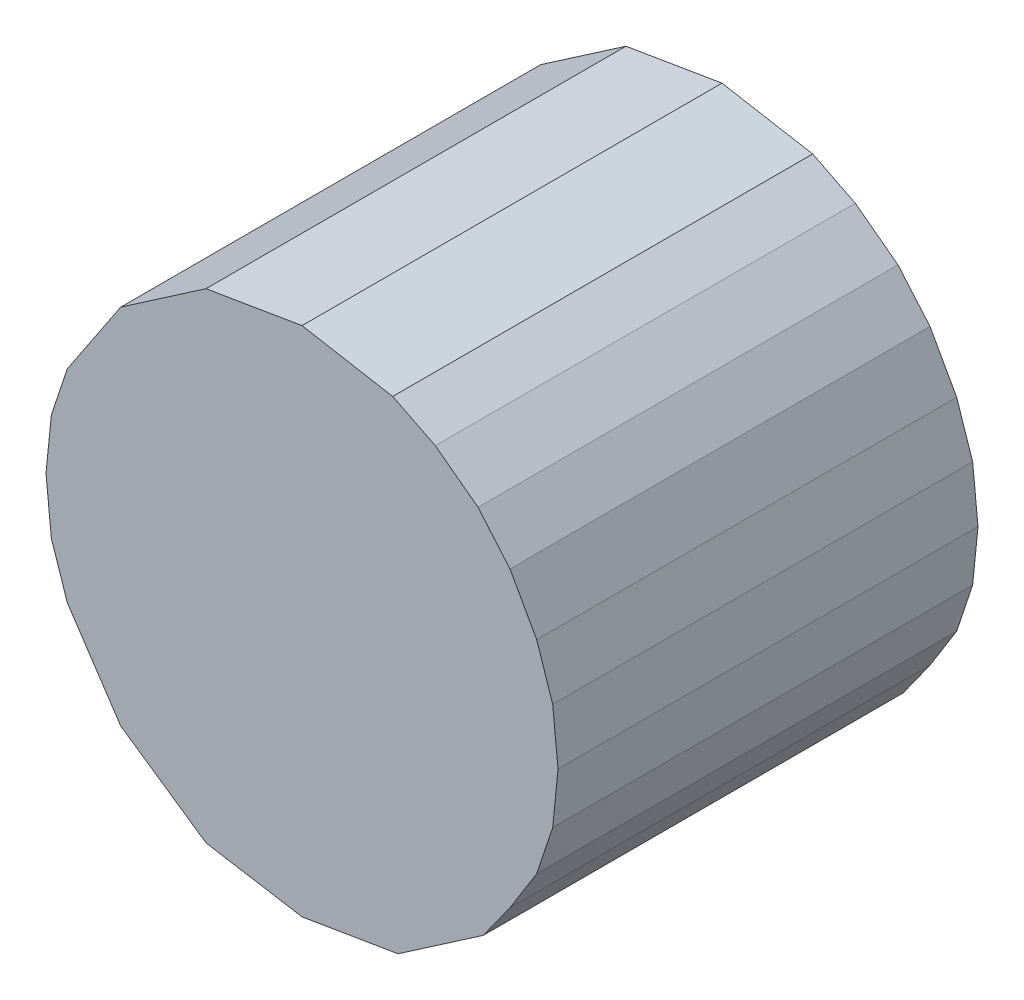
ISO-10303-21;
HEADER;
FILE_DESCRIPTION(('STEP AP214'),'2;1');
FILE_NAME('part.step','',(''),(''),'','','');
FILE_SCHEMA(('AUTOMOTIVE_DESIGN { 1 0 10303 214 1 1 1 1 }'));
ENDSEC;
DATA;
#1=APPLICATION_CONTEXT('core data for automotive mechanical design processes');
#2=APPLICATION_PROTOCOL_DEFINITION('international standard','automotive_design',2000,#1);
#3=PRODUCT_CONTEXT('',#1,'mechanical');
#4=PRODUCT('Part','Part','',(#3));
#5=PRODUCT_RELATED_PRODUCT_CATEGORY('part','',(#4));
#6=PRODUCT_DEFINITION_FORMATION('','',#4);
#7=PRODUCT_DEFINITION_CONTEXT('part definition',#1,'design');
#8=PRODUCT_DEFINITION('design','',#6,#7);
#9=PRODUCT_DEFINITION_SHAPE('','',#8);
#10=(LENGTH_UNIT() NAMED_UNIT(*) SI_UNIT(.MILLI.,.METRE.));
#11=(NAMED_UNIT(*) PLANE_ANGLE_UNIT() SI_UNIT($,.RADIAN.));
#12=(NAMED_UNIT(*) SI_UNIT($,.STERADIAN.) SOLID_ANGLE_UNIT());
#13=UNCERTAINTY_MEASURE_WITH_UNIT(LENGTH_MEASURE(1.E-05),#10,'distance_accuracy_value','');
#14=(GEOMETRIC_REPRESENTATION_CONTEXT(3) GLOBAL_UNCERTAINTY_ASSIGNED_CONTEXT((#13)) GLOBAL_UNIT_ASSIGNED_CONTEXT((#10,
#11,#12)) REPRESENTATION_CONTEXT('',''));
#15=CARTESIAN_POINT('',(0.,0.,0.));
#16=DIRECTION('',(0.,0.,1.));
#17=DIRECTION('',(1.,0.,0.));
#18=AXIS2_PLACEMENT_3D('',#15,#16,#17);
#19=CARTESIAN_POINT('',(5.969,1.27,0.));
#20=DIRECTION('',(-0.948683298050514,-0.316227766016838,0.));
#21=DIRECTION('',(0.316227766016838,-0.948683298050514,0.));
#22=AXIS2_PLACEMENT_3D('',#19,#20,#21);
#23=PLANE('',#22);
#24=DIRECTION('',(0.,0.,1.));
#25=VECTOR('',#24,1.);
#26=CARTESIAN_POINT('',(5.588,2.413,0.));
#27=LINE('',#26,#25);
#28=CARTESIAN_POINT('',(5.588,2.413,0.));
#29=VERTEX_POINT('',#28);
#30=CARTESIAN_POINT('',(5.588,2.413,10.));
#31=VERTEX_POINT('',#30);
#32=EDGE_CURVE('E189',#29,#31,#27,.T.);
#33=ORIENTED_EDGE('',*,*,#32,.T.);
#34=DIRECTION('',(0.316227766016838,-0.948683298050514,0.));
#35=VECTOR('',#34,1.);
#36=CARTESIAN_POINT('',(5.969,1.27,10.));
#37=LINE('',#36,#35);
#38=CARTESIAN_POINT('',(5.969,1.27,10.));
#39=VERTEX_POINT('',#38);
#40=EDGE_CURVE('E20',#39,#31,#37,.F.);
#41=ORIENTED_EDGE('',*,*,#40,.F.);
#42=DIRECTION('',(0.,0.,1.));
#43=VECTOR('',#42,1.);
#44=CARTESIAN_POINT('',(5.969,1.27,0.));
#45=LINE('',#44,#43);
#46=CARTESIAN_POINT('',(5.969,1.27,0.));
#47=VERTEX_POINT('',#46);
#48=EDGE_CURVE('E184',#39,#47,#45,.F.);
#49=ORIENTED_EDGE('',*,*,#48,.T.);
#50=DIRECTION('',(0.316227766016838,-0.948683298050514,0.));
#51=VECTOR('',#50,1.);
#52=CARTESIAN_POINT('',(5.969,1.27,0.));
#53=LINE('',#52,#51);
#54=EDGE_CURVE('E168',#29,#47,#53,.T.);
#55=ORIENTED_EDGE('',*,*,#54,.F.);
#56=EDGE_LOOP('',(#33,#41,#49,#55));
#57=FACE_BOUND('',#56,.T.);
#58=ADVANCED_FACE('F17',(#57),#23,.F.);
#59=CARTESIAN_POINT('',(6.096,0.,0.));
#60=DIRECTION('',(-0.995037190209989,-0.0995037190209989,0.));
#61=DIRECTION('',(0.0995037190209989,-0.995037190209989,0.));
#62=AXIS2_PLACEMENT_3D('',#59,#60,#61);
#63=PLANE('',#62);
#64=ORIENTED_EDGE('',*,*,#48,.F.);
#65=DIRECTION('',(0.0995037190209989,-0.995037190209989,0.));
#66=VECTOR('',#65,1.);
#67=CARTESIAN_POINT('',(6.096,0.,10.));
#68=LINE('',#67,#66);
#69=CARTESIAN_POINT('',(6.096,0.,10.));
#70=VERTEX_POINT('',#69);
#71=EDGE_CURVE('E173',#70,#39,#68,.F.);
#72=ORIENTED_EDGE('',*,*,#71,.F.);
#73=DIRECTION('',(0.,0.,1.));
#74=VECTOR('',#73,1.);
#75=CARTESIAN_POINT('',(6.096,0.,0.));
#76=LINE('',#75,#74);
#77=CARTESIAN_POINT('',(6.096,0.,0.));
#78=VERTEX_POINT('',#77);
#79=EDGE_CURVE('E202',#70,#78,#76,.F.);
#80=ORIENTED_EDGE('',*,*,#79,.T.);
#81=DIRECTION('',(0.0995037190209989,-0.995037190209989,0.));
#82=VECTOR('',#81,1.);
#83=CARTESIAN_POINT('',(6.096,0.,0.));
#84=LINE('',#83,#82);
#85=EDGE_CURVE('E192',#47,#78,#84,.T.);
#86=ORIENTED_EDGE('',*,*,#85,.F.);
#87=EDGE_LOOP('',(#64,#72,#80,#86));
#88=FACE_BOUND('',#87,.T.);
#89=ADVANCED_FACE('F191',(#88),#63,.F.);
#90=CARTESIAN_POINT('',(5.588,2.413,0.));
#91=DIRECTION('',(-0.874157276121255,-0.485642931179142,0.));
#92=DIRECTION('',(0.485642931179142,-0.874157276121255,0.));
#93=AXIS2_PLACEMENT_3D('',#90,#91,#92);
#94=PLANE('',#93);
#95=DIRECTION('',(0.,0.,1.));
#96=VECTOR('',#95,1.);
#97=CARTESIAN_POINT('',(4.953,3.556,0.));
#98=LINE('',#97,#96);
#99=CARTESIAN_POINT('',(4.95299999999967,3.55599999999982,0.));
#100=VERTEX_POINT('',#99);
#101=CARTESIAN_POINT('',(4.95299999999967,3.55599999999982,10.));
#102=VERTEX_POINT('',#101);
#103=EDGE_CURVE('E206',#100,#102,#98,.T.);
#104=ORIENTED_EDGE('',*,*,#103,.T.);
#105=DIRECTION('',(0.485642931179142,-0.874157276121255,0.));
#106=VECTOR('',#105,1.);
#107=CARTESIAN_POINT('',(5.588,2.413,10.));
#108=LINE('',#107,#106);
#109=EDGE_CURVE('E197',#31,#102,#108,.F.);
#110=ORIENTED_EDGE('',*,*,#109,.F.);
#111=ORIENTED_EDGE('',*,*,#32,.F.);
#112=DIRECTION('',(0.485642931179142,-0.874157276121255,0.));
#113=VECTOR('',#112,1.);
#114=CARTESIAN_POINT('',(5.588,2.413,0.));
#115=LINE('',#114,#113);
#116=EDGE_CURVE('E199',#100,#29,#115,.T.);
#117=ORIENTED_EDGE('',*,*,#116,.F.);
#118=EDGE_LOOP('',(#104,#110,#111,#117));
#119=FACE_BOUND('',#118,.T.);
#120=ADVANCED_FACE('F402',(#119),#94,.F.);
#121=CARTESIAN_POINT('',(5.969,-1.27,0.));
#122=DIRECTION('',(-0.995037190209989,0.0995037190209989,0.));
#123=DIRECTION('',(-0.0995037190209989,-0.995037190209989,0.));
#124=AXIS2_PLACEMENT_3D('',#121,#122,#123);
#125=PLANE('',#124);
#126=ORIENTED_EDGE('',*,*,#79,.F.);
#127=DIRECTION('',(-0.0995037190209989,-0.995037190209989,0.));
#128=VECTOR('',#127,1.);
#129=CARTESIAN_POINT('',(5.969,-1.27,10.));
#130=LINE('',#129,#128);
#131=CARTESIAN_POINT('',(5.969,-1.27,10.));
#132=VERTEX_POINT('',#131);
#133=EDGE_CURVE('E179',#132,#70,#130,.F.);
#134=ORIENTED_EDGE('',*,*,#133,.F.);
#135=DIRECTION('',(0.,0.,1.));
#136=VECTOR('',#135,1.);
#137=CARTESIAN_POINT('',(5.969,-1.27,0.));
#138=LINE('',#137,#136);
#139=CARTESIAN_POINT('',(5.969,-1.27,0.));
#140=VERTEX_POINT('',#139);
#141=EDGE_CURVE('E216',#132,#140,#138,.F.);
#142=ORIENTED_EDGE('',*,*,#141,.T.);
#143=DIRECTION('',(-0.0995037190209989,-0.995037190209989,0.));
#144=VECTOR('',#143,1.);
#145=CARTESIAN_POINT('',(5.969,-1.27,0.));
#146=LINE('',#145,#144);
#147=EDGE_CURVE('E204',#78,#140,#146,.T.);
#148=ORIENTED_EDGE('',*,*,#147,.F.);
#149=EDGE_LOOP('',(#126,#134,#142,#148));
#150=FACE_BOUND('',#149,.T.);
#151=ADVANCED_FACE('F404',(#150),#125,.F.);
#152=CARTESIAN_POINT('',(4.953,3.556,0.));
#153=DIRECTION('',(-0.759256602365155,-0.650791373456133,0.));
#154=DIRECTION('',(0.650791373456133,-0.759256602365155,0.));
#155=AXIS2_PLACEMENT_3D('',#152,#153,#154);
#156=PLANE('',#155);
#157=DIRECTION('',(0.,0.,1.));
#158=VECTOR('',#157,1.);
#159=CARTESIAN_POINT('',(4.191,4.445,0.));
#160=LINE('',#159,#158);
#161=CARTESIAN_POINT('',(4.1909999999999,4.44499999999992,0.));
#162=VERTEX_POINT('',#161);
#163=CARTESIAN_POINT('',(4.1909999999999,4.44499999999992,10.));
#164=VERTEX_POINT('',#163);
#165=EDGE_CURVE('E225',#162,#164,#160,.T.);
#166=ORIENTED_EDGE('',*,*,#165,.T.);
#167=DIRECTION('',(0.650791373456133,-0.759256602365155,0.));
#168=VECTOR('',#167,1.);
#169=CARTESIAN_POINT('',(4.953,3.556,10.));
#170=LINE('',#169,#168);
#171=EDGE_CURVE('E209',#102,#164,#170,.F.);
#172=ORIENTED_EDGE('',*,*,#171,.F.);
#173=ORIENTED_EDGE('',*,*,#103,.F.);
#174=DIRECTION('',(0.650791373456133,-0.759256602365155,0.));
#175=VECTOR('',#174,1.);
#176=CARTESIAN_POINT('',(4.953,3.556,0.));
#177=LINE('',#176,#175);
#178=EDGE_CURVE('E211',#162,#100,#177,.T.);
#179=ORIENTED_EDGE('',*,*,#178,.F.);
#180=EDGE_LOOP('',(#166,#172,#173,#179));
#181=FACE_BOUND('',#180,.T.);
#182=ADVANCED_FACE('F399',(#181),#156,.F.);
#183=CARTESIAN_POINT('',(5.588,-2.413,0.));
#184=DIRECTION('',(-0.948683298050514,0.316227766016838,0.));
#185=DIRECTION('',(-0.316227766016838,-0.948683298050514,0.));
#186=AXIS2_PLACEMENT_3D('',#183,#184,#185);
#187=PLANE('',#186);
#188=ORIENTED_EDGE('',*,*,#141,.F.);
#189=DIRECTION('',(-0.316227766016838,-0.948683298050514,0.));
#190=VECTOR('',#189,1.);
#191=CARTESIAN_POINT('',(5.588,-2.413,10.));
#192=LINE('',#191,#190);
#193=CARTESIAN_POINT('',(5.58799999999997,-2.41299999999998,10.));
#194=VERTEX_POINT('',#193);
#195=EDGE_CURVE('E214',#194,#132,#192,.F.);
#196=ORIENTED_EDGE('',*,*,#195,.F.);
#197=DIRECTION('',(0.,0.,1.));
#198=VECTOR('',#197,1.);
#199=CARTESIAN_POINT('',(5.58799999999989,-2.41299999999993,0.));
#200=LINE('',#199,#198);
#201=CARTESIAN_POINT('',(5.58799999999997,-2.41299999999998,0.));
#202=VERTEX_POINT('',#201);
#203=EDGE_CURVE('E235',#194,#202,#200,.F.);
#204=ORIENTED_EDGE('',*,*,#203,.T.);
#205=DIRECTION('',(-0.316227766016838,-0.948683298050514,0.));
#206=VECTOR('',#205,1.);
#207=CARTESIAN_POINT('',(5.588,-2.413,0.));
#208=LINE('',#207,#206);
#209=EDGE_CURVE('E219',#140,#202,#208,.T.);
#210=ORIENTED_EDGE('',*,*,#209,.F.);
#211=EDGE_LOOP('',(#188,#196,#204,#210));
#212=FACE_BOUND('',#211,.T.);
#213=ADVANCED_FACE('F464',(#212),#187,.F.);
#214=CARTESIAN_POINT('',(-5.969,1.27,0.));
#215=DIRECTION('',(0.995037190209989,-0.0995037190209989,0.));
#216=DIRECTION('',(0.0995037190209989,0.995037190209989,0.));
#217=AXIS2_PLACEMENT_3D('',#214,#215,#216);
#218=PLANE('',#217);
#219=DIRECTION('',(0.,0.,1.));
#220=VECTOR('',#219,1.);
#221=CARTESIAN_POINT('',(-6.096,0.,0.));
#222=LINE('',#221,#220);
#223=CARTESIAN_POINT('',(-6.096,0.,0.));
#224=VERTEX_POINT('',#223);
#225=CARTESIAN_POINT('',(-6.096,0.,10.));
#226=VERTEX_POINT('',#225);
#227=EDGE_CURVE('E240',#224,#226,#222,.T.);
#228=ORIENTED_EDGE('',*,*,#227,.T.);
#229=DIRECTION('',(0.0995037190209989,0.995037190209989,0.));
#230=VECTOR('',#229,1.);
#231=CARTESIAN_POINT('',(-5.969,1.27,10.));
#232=LINE('',#231,#230);
#233=CARTESIAN_POINT('',(-5.969,1.27,10.));
#234=VERTEX_POINT('',#233);
#235=EDGE_CURVE('E221',#234,#226,#232,.F.);
#236=ORIENTED_EDGE('',*,*,#235,.F.);
#237=DIRECTION('',(0.,0.,1.));
#238=VECTOR('',#237,1.);
#239=CARTESIAN_POINT('',(-5.969,1.27,0.));
#240=LINE('',#239,#238);
#241=CARTESIAN_POINT('',(-5.969,1.27,0.));
#242=VERTEX_POINT('',#241);
#243=EDGE_CURVE('E248',#234,#242,#240,.F.);
#244=ORIENTED_EDGE('',*,*,#243,.T.);
#245=DIRECTION('',(0.0995037190209989,0.995037190209989,0.));
#246=VECTOR('',#245,1.);
#247=CARTESIAN_POINT('',(-5.969,1.27,0.));
#248=LINE('',#247,#246);
#249=EDGE_CURVE('E223',#224,#242,#248,.T.);
#250=ORIENTED_EDGE('',*,*,#249,.F.);
#251=EDGE_LOOP('',(#228,#236,#244,#250));
#252=FACE_BOUND('',#251,.T.);
#253=ADVANCED_FACE('F365',(#252),#218,.F.);
#254=CARTESIAN_POINT('',(4.191,4.445,0.));
#255=DIRECTION('',(-0.6,-0.8,0.));
#256=DIRECTION('',(0.8,-0.6,0.));
#257=AXIS2_PLACEMENT_3D('',#254,#255,#256);
#258=PLANE('',#257);
#259=DIRECTION('',(0.,0.,1.));
#260=VECTOR('',#259,1.);
#261=CARTESIAN_POINT('',(3.175,5.207,0.));
#262=LINE('',#261,#260);
#263=CARTESIAN_POINT('',(3.175,5.207,0.));
#264=VERTEX_POINT('',#263);
#265=CARTESIAN_POINT('',(3.175,5.207,10.));
#266=VERTEX_POINT('',#265);
#267=EDGE_CURVE('E253',#264,#266,#262,.T.);
#268=ORIENTED_EDGE('',*,*,#267,.T.);
#269=DIRECTION('',(0.8,-0.6,0.));
#270=VECTOR('',#269,1.);
#271=CARTESIAN_POINT('',(4.191,4.445,10.));
#272=LINE('',#271,#270);
#273=EDGE_CURVE('E228',#164,#266,#272,.F.);
#274=ORIENTED_EDGE('',*,*,#273,.F.);
#275=ORIENTED_EDGE('',*,*,#165,.F.);
#276=DIRECTION('',(0.8,-0.6,0.));
#277=VECTOR('',#276,1.);
#278=CARTESIAN_POINT('',(4.191,4.445,0.));
#279=LINE('',#278,#277);
#280=EDGE_CURVE('E230',#264,#162,#279,.T.);
#281=ORIENTED_EDGE('',*,*,#280,.F.);
#282=EDGE_LOOP('',(#268,#274,#275,#281));
#283=FACE_BOUND('',#282,.T.);
#284=ADVANCED_FACE('F396',(#283),#258,.F.);
#285=CARTESIAN_POINT('',(4.953,-3.429,0.));
#286=DIRECTION('',(-0.847998304005144,0.52999894000309,0.));
#287=DIRECTION('',(-0.52999894000309,-0.847998304005144,0.));
#288=AXIS2_PLACEMENT_3D('',#285,#286,#287);
#289=PLANE('',#288);
#290=ORIENTED_EDGE('',*,*,#203,.F.);
#291=DIRECTION('',(-0.52999894000309,-0.847998304005144,0.));
#292=VECTOR('',#291,1.);
#293=CARTESIAN_POINT('',(4.953,-3.429,10.));
#294=LINE('',#293,#292);
#295=CARTESIAN_POINT('',(4.95299999999997,-3.42899999999994,10.));
#296=VERTEX_POINT('',#295);
#297=EDGE_CURVE('E233',#296,#194,#294,.F.);
#298=ORIENTED_EDGE('',*,*,#297,.F.);
#299=DIRECTION('',(0.,0.,1.));
#300=VECTOR('',#299,1.);
#301=CARTESIAN_POINT('',(4.95299999999979,-3.42899999999985,0.));
#302=LINE('',#301,#300);
#303=CARTESIAN_POINT('',(4.95299999999997,-3.42899999999994,0.));
#304=VERTEX_POINT('',#303);
#305=EDGE_CURVE('E259',#296,#304,#302,.F.);
#306=ORIENTED_EDGE('',*,*,#305,.T.);
#307=DIRECTION('',(-0.52999894000309,-0.847998304005144,0.));
#308=VECTOR('',#307,1.);
#309=CARTESIAN_POINT('',(4.953,-3.429,0.));
#310=LINE('',#309,#308);
#311=EDGE_CURVE('E238',#202,#304,#310,.T.);
#312=ORIENTED_EDGE('',*,*,#311,.F.);
#313=EDGE_LOOP('',(#290,#298,#306,#312));
#314=FACE_BOUND('',#313,.T.);
#315=ADVANCED_FACE('F456',(#314),#289,.F.);
#316=CARTESIAN_POINT('',(-6.096,0.,0.));
#317=DIRECTION('',(0.995037190209989,0.0995037190209989,0.));
#318=DIRECTION('',(-0.0995037190209989,0.995037190209989,0.));
#319=AXIS2_PLACEMENT_3D('',#316,#317,#318);
#320=PLANE('',#319);
#321=DIRECTION('',(0.,0.,1.));
#322=VECTOR('',#321,1.);
#323=CARTESIAN_POINT('',(-5.969,-1.27,0.));
#324=LINE('',#323,#322);
#325=CARTESIAN_POINT('',(-5.969,-1.27,0.));
#326=VERTEX_POINT('',#325);
#327=CARTESIAN_POINT('',(-5.969,-1.27,10.));
#328=VERTEX_POINT('',#327);
#329=EDGE_CURVE('E264',#326,#328,#324,.T.);
#330=ORIENTED_EDGE('',*,*,#329,.T.);
#331=DIRECTION('',(-0.0995037190209989,0.995037190209989,0.));
#332=VECTOR('',#331,1.);
#333=CARTESIAN_POINT('',(-6.096,0.,10.));
#334=LINE('',#333,#332);
#335=EDGE_CURVE('E243',#226,#328,#334,.F.);
#336=ORIENTED_EDGE('',*,*,#335,.F.);
#337=ORIENTED_EDGE('',*,*,#227,.F.);
#338=DIRECTION('',(-0.0995037190209989,0.995037190209989,0.));
#339=VECTOR('',#338,1.);
#340=CARTESIAN_POINT('',(-6.096,0.,0.));
#341=LINE('',#340,#339);
#342=EDGE_CURVE('E245',#326,#224,#341,.T.);
#343=ORIENTED_EDGE('',*,*,#342,.F.);
#344=EDGE_LOOP('',(#330,#336,#337,#343));
#345=FACE_BOUND('',#344,.T.);
#346=ADVANCED_FACE('F361',(#345),#320,.F.);
#347=CARTESIAN_POINT('',(-5.588,2.413,0.));
#348=DIRECTION('',(0.948683298050514,-0.316227766016838,0.));
#349=DIRECTION('',(0.316227766016838,0.948683298050514,0.));
#350=AXIS2_PLACEMENT_3D('',#347,#348,#349);
#351=PLANE('',#350);
#352=ORIENTED_EDGE('',*,*,#243,.F.);
#353=DIRECTION('',(0.316227766016838,0.948683298050514,0.));
#354=VECTOR('',#353,1.);
#355=CARTESIAN_POINT('',(-5.969,1.27,10.));
#356=LINE('',#355,#354);
#357=CARTESIAN_POINT('',(-5.58799999999987,2.41299999999991,10.));
#358=VERTEX_POINT('',#357);
#359=EDGE_CURVE('E268',#234,#358,#356,.T.);
#360=ORIENTED_EDGE('',*,*,#359,.T.);
#361=DIRECTION('',(0.,0.,1.));
#362=VECTOR('',#361,1.);
#363=CARTESIAN_POINT('',(-5.58799999999947,2.41299999999965,0.));
#364=LINE('',#363,#362);
#365=CARTESIAN_POINT('',(-5.58799999999987,2.41299999999991,0.));
#366=VERTEX_POINT('',#365);
#367=EDGE_CURVE('E281',#358,#366,#364,.F.);
#368=ORIENTED_EDGE('',*,*,#367,.T.);
#369=DIRECTION('',(0.316227766016838,0.948683298050514,0.));
#370=VECTOR('',#369,1.);
#371=CARTESIAN_POINT('',(-5.588,2.413,0.));
#372=LINE('',#371,#370);
#373=EDGE_CURVE('E251',#242,#366,#372,.T.);
#374=ORIENTED_EDGE('',*,*,#373,.F.);
#375=EDGE_LOOP('',(#352,#360,#368,#374));
#376=FACE_BOUND('',#375,.T.);
#377=ADVANCED_FACE('F367',(#376),#351,.F.);
#378=CARTESIAN_POINT('',(3.175,5.207,0.));
#379=DIRECTION('',(-0.447213595499958,-0.894427190999916,0.));
#380=DIRECTION('',(0.894427190999916,-0.447213595499958,0.));
#381=AXIS2_PLACEMENT_3D('',#378,#379,#380);
#382=PLANE('',#381);
#383=DIRECTION('',(0.,0.,1.));
#384=VECTOR('',#383,1.);
#385=CARTESIAN_POINT('',(2.159,5.715,0.));
#386=LINE('',#385,#384);
#387=CARTESIAN_POINT('',(2.159,5.715,0.));
#388=VERTEX_POINT('',#387);
#389=CARTESIAN_POINT('',(2.159,5.715,10.));
#390=VERTEX_POINT('',#389);
#391=EDGE_CURVE('E292',#388,#390,#386,.T.);
#392=ORIENTED_EDGE('',*,*,#391,.T.);
#393=DIRECTION('',(0.894427190999916,-0.447213595499958,0.));
#394=VECTOR('',#393,1.);
#395=CARTESIAN_POINT('',(2.159,5.715,10.));
#396=LINE('',#395,#394);
#397=EDGE_CURVE('E270',#390,#266,#396,.T.);
#398=ORIENTED_EDGE('',*,*,#397,.T.);
#399=ORIENTED_EDGE('',*,*,#267,.F.);
#400=DIRECTION('',(0.894427190999916,-0.447213595499958,0.));
#401=VECTOR('',#400,1.);
#402=CARTESIAN_POINT('',(3.175,5.207,0.));
#403=LINE('',#402,#401);
#404=EDGE_CURVE('E256',#388,#264,#403,.T.);
#405=ORIENTED_EDGE('',*,*,#404,.F.);
#406=EDGE_LOOP('',(#392,#398,#399,#405));
#407=FACE_BOUND('',#406,.T.);
#408=ADVANCED_FACE('F392',(#407),#382,.F.);
#409=CARTESIAN_POINT('',(4.318,-4.318,0.));
#410=DIRECTION('',(-0.81373347120687,0.581238193718907,0.));
#411=DIRECTION('',(-0.581238193718907,-0.81373347120687,0.));
#412=AXIS2_PLACEMENT_3D('',#409,#410,#411);
#413=PLANE('',#412);
#414=ORIENTED_EDGE('',*,*,#305,.F.);
#415=DIRECTION('',(-0.581238193719097,-0.813733471206735,0.));
#416=VECTOR('',#415,1.);
#417=CARTESIAN_POINT('',(4.953,-3.429,10.));
#418=LINE('',#417,#416);
#419=CARTESIAN_POINT('',(4.31799999999995,-4.31799999999992,10.));
#420=VERTEX_POINT('',#419);
#421=EDGE_CURVE('E273',#296,#420,#418,.T.);
#422=ORIENTED_EDGE('',*,*,#421,.T.);
#423=DIRECTION('',(0.,0.,1.));
#424=VECTOR('',#423,1.);
#425=CARTESIAN_POINT('',(4.31799999999978,-4.31799999999969,0.));
#426=LINE('',#425,#424);
#427=CARTESIAN_POINT('',(4.31799999999995,-4.31799999999992,0.));
#428=VERTEX_POINT('',#427);
#429=EDGE_CURVE('E301',#420,#428,#426,.F.);
#430=ORIENTED_EDGE('',*,*,#429,.T.);
#431=DIRECTION('',(-0.581238193718907,-0.81373347120687,0.));
#432=VECTOR('',#431,1.);
#433=CARTESIAN_POINT('',(4.318,-4.318,0.));
#434=LINE('',#433,#432);
#435=EDGE_CURVE('E262',#304,#428,#434,.T.);
#436=ORIENTED_EDGE('',*,*,#435,.F.);
#437=EDGE_LOOP('',(#414,#422,#430,#436));
#438=FACE_BOUND('',#437,.T.);
#439=ADVANCED_FACE('F446',(#438),#413,.F.);
#440=CARTESIAN_POINT('',(-5.969,-1.27,0.));
#441=DIRECTION('',(0.948683298050514,0.316227766016838,0.));
#442=DIRECTION('',(-0.316227766016838,0.948683298050514,0.));
#443=AXIS2_PLACEMENT_3D('',#440,#441,#442);
#444=PLANE('',#443);
#445=DIRECTION('',(0.,0.,1.));
#446=VECTOR('',#445,1.);
#447=CARTESIAN_POINT('',(-5.588,-2.413,0.));
#448=LINE('',#447,#446);
#449=CARTESIAN_POINT('',(-5.588,-2.413,0.));
#450=VERTEX_POINT('',#449);
#451=CARTESIAN_POINT('',(-5.588,-2.413,10.));
#452=VERTEX_POINT('',#451);
#453=EDGE_CURVE('E316',#450,#452,#448,.T.);
#454=ORIENTED_EDGE('',*,*,#453,.T.);
#455=DIRECTION('',(-0.316227766016838,0.948683298050514,0.));
#456=VECTOR('',#455,1.);
#457=CARTESIAN_POINT('',(-5.588,-2.413,10.));
#458=LINE('',#457,#456);
#459=EDGE_CURVE('E275',#452,#328,#458,.T.);
#460=ORIENTED_EDGE('',*,*,#459,.T.);
#461=ORIENTED_EDGE('',*,*,#329,.F.);
#462=DIRECTION('',(-0.316227766016838,0.948683298050514,0.));
#463=VECTOR('',#462,1.);
#464=CARTESIAN_POINT('',(-5.969,-1.27,0.));
#465=LINE('',#464,#463);
#466=EDGE_CURVE('E35',#450,#326,#465,.T.);
#467=ORIENTED_EDGE('',*,*,#466,.F.);
#468=EDGE_LOOP('',(#454,#460,#461,#467));
#469=FACE_BOUND('',#468,.T.);
#470=ADVANCED_FACE('F356',(#469),#444,.F.);
#471=CARTESIAN_POINT('',(-6.096,0.,10.));
#472=DIRECTION('',(0.,0.,-1.));
#473=DIRECTION('',(-1.,0.,0.));
#474=AXIS2_PLACEMENT_3D('',#471,#472,#473);
#475=PLANE('',#474);
#476=ORIENTED_EDGE('',*,*,#459,.F.);
#477=DIRECTION('',(-0.554700196224998,0.832050294337997,0.));
#478=VECTOR('',#477,1.);
#479=CARTESIAN_POINT('',(-5.588,-2.413,10.));
#480=LINE('',#479,#478);
#481=CARTESIAN_POINT('',(-4.31800000000013,-4.31800000000009,10.));
#482=VERTEX_POINT('',#481);
#483=EDGE_CURVE('E318',#452,#482,#480,.F.);
#484=ORIENTED_EDGE('',*,*,#483,.T.);
#485=DIRECTION('',(-0.82404192419928,0.566528822887193,0.));
#486=VECTOR('',#485,1.);
#487=CARTESIAN_POINT('',(-4.318,-4.318,10.));
#488=LINE('',#487,#486);
#489=CARTESIAN_POINT('',(-2.28600000000005,-5.71500000000008,10.));
#490=VERTEX_POINT('',#489);
#491=EDGE_CURVE('E312',#482,#490,#488,.F.);
#492=ORIENTED_EDGE('',*,*,#491,.T.);
#493=DIRECTION('',(-0.986393923832198,0.164398987305033,0.));
#494=VECTOR('',#493,1.);
#495=CARTESIAN_POINT('',(-2.286,-5.715,10.));
#496=LINE('',#495,#494);
#497=CARTESIAN_POINT('',(0.,-6.09599999999981,10.));
#498=VERTEX_POINT('',#497);
#499=EDGE_CURVE('E308',#490,#498,#496,.F.);
#500=ORIENTED_EDGE('',*,*,#499,.T.);
#501=DIRECTION('',(-0.986393923832198,-0.164398987305033,0.));
#502=VECTOR('',#501,1.);
#503=CARTESIAN_POINT('',(0.,-6.096,10.));
#504=LINE('',#503,#502);
#505=CARTESIAN_POINT('',(2.28600000000003,-5.71500000000019,10.));
#506=VERTEX_POINT('',#505);
#507=EDGE_CURVE('E304',#498,#506,#504,.F.);
#508=ORIENTED_EDGE('',*,*,#507,.T.);
#509=DIRECTION('',(-0.82404192419928,-0.566528822887193,0.));
#510=VECTOR('',#509,1.);
#511=CARTESIAN_POINT('',(2.286,-5.715,10.));
#512=LINE('',#511,#510);
#513=EDGE_CURVE('E298',#506,#420,#512,.F.);
#514=ORIENTED_EDGE('',*,*,#513,.T.);
#515=ORIENTED_EDGE('',*,*,#421,.F.);
#516=ORIENTED_EDGE('',*,*,#297,.T.);
#517=ORIENTED_EDGE('',*,*,#195,.T.);
#518=ORIENTED_EDGE('',*,*,#133,.T.);
#519=ORIENTED_EDGE('',*,*,#71,.T.);
#520=ORIENTED_EDGE('',*,*,#40,.T.);
#521=ORIENTED_EDGE('',*,*,#109,.T.);
#522=ORIENTED_EDGE('',*,*,#171,.T.);
#523=ORIENTED_EDGE('',*,*,#273,.T.);
#524=ORIENTED_EDGE('',*,*,#397,.F.);
#525=DIRECTION('',(0.984783558817947,-0.173785333908991,0.));
#526=VECTOR('',#525,1.);
#527=CARTESIAN_POINT('',(2.159,5.715,10.));
#528=LINE('',#527,#526);
#529=CARTESIAN_POINT('',(0.,6.09599999999997,10.));
#530=VERTEX_POINT('',#529);
#531=EDGE_CURVE('E294',#390,#530,#528,.F.);
#532=ORIENTED_EDGE('',*,*,#531,.T.);
#533=DIRECTION('',(0.986393923832198,0.164398987305033,0.));
#534=VECTOR('',#533,1.);
#535=CARTESIAN_POINT('',(0.,6.096,10.));
#536=LINE('',#535,#534);
#537=CARTESIAN_POINT('',(-2.28600000000003,5.71500000000019,10.));
#538=VERTEX_POINT('',#537);
#539=EDGE_CURVE('E288',#530,#538,#536,.F.);
#540=ORIENTED_EDGE('',*,*,#539,.T.);
#541=DIRECTION('',(0.82404192419928,0.566528822887193,0.));
#542=VECTOR('',#541,1.);
#543=CARTESIAN_POINT('',(-2.286,5.715,10.));
#544=LINE('',#543,#542);
#545=CARTESIAN_POINT('',(-4.31799999999995,4.31799999999992,10.));
#546=VERTEX_POINT('',#545);
#547=EDGE_CURVE('E284',#538,#546,#544,.F.);
#548=ORIENTED_EDGE('',*,*,#547,.T.);
#549=DIRECTION('',(0.554700196224998,0.832050294337997,0.));
#550=VECTOR('',#549,1.);
#551=CARTESIAN_POINT('',(-4.318,4.318,10.));
#552=LINE('',#551,#550);
#553=EDGE_CURVE('E278',#546,#358,#552,.F.);
#554=ORIENTED_EDGE('',*,*,#553,.T.);
#555=ORIENTED_EDGE('',*,*,#359,.F.);
#556=ORIENTED_EDGE('',*,*,#235,.T.);
#557=ORIENTED_EDGE('',*,*,#335,.T.);
#558=EDGE_LOOP('',(#476,#484,#492,#500,#508,#514,#515,#516,#517,#518,#519,#520,#521,#522,#523,
#524,#532,#540,#548,#554,#555,#556,#557));
#559=FACE_BOUND('',#558,.T.);
#560=ADVANCED_FACE('F176',(#559),#475,.F.);
#561=CARTESIAN_POINT('',(-4.318,4.318,0.));
#562=DIRECTION('',(0.832050294337997,-0.554700196224998,0.));
#563=DIRECTION('',(0.554700196224998,0.832050294337997,0.));
#564=AXIS2_PLACEMENT_3D('',#561,#562,#563);
#565=PLANE('',#564);
#566=ORIENTED_EDGE('',*,*,#367,.F.);
#567=ORIENTED_EDGE('',*,*,#553,.F.);
#568=DIRECTION('',(0.,0.,1.));
#569=VECTOR('',#568,1.);
#570=CARTESIAN_POINT('',(-4.31799999999978,4.31799999999969,0.));
#571=LINE('',#570,#569);
#572=CARTESIAN_POINT('',(-4.31799999999995,4.31799999999992,0.));
#573=VERTEX_POINT('',#572);
#574=EDGE_CURVE('E286',#546,#573,#571,.F.);
#575=ORIENTED_EDGE('',*,*,#574,.T.);
#576=DIRECTION('',(0.554700196225229,0.832050294337844,0.));
#577=VECTOR('',#576,1.);
#578=CARTESIAN_POINT('',(-5.588,2.413,0.));
#579=LINE('',#578,#577);
#580=EDGE_CURVE('E322',#366,#573,#579,.T.);
#581=ORIENTED_EDGE('',*,*,#580,.F.);
#582=EDGE_LOOP('',(#566,#567,#575,#581));
#583=FACE_BOUND('',#582,.T.);
#584=ADVANCED_FACE('F372',(#583),#565,.F.);
#585=CARTESIAN_POINT('',(-2.286,5.715,0.));
#586=DIRECTION('',(0.566528822887193,-0.82404192419928,0.));
#587=DIRECTION('',(0.82404192419928,0.566528822887193,0.));
#588=AXIS2_PLACEMENT_3D('',#585,#586,#587);
#589=PLANE('',#588);
#590=ORIENTED_EDGE('',*,*,#574,.F.);
#591=ORIENTED_EDGE('',*,*,#547,.F.);
#592=DIRECTION('',(0.,0.,1.));
#593=VECTOR('',#592,1.);
#594=CARTESIAN_POINT('',(-2.28600000000013,5.71500000000075,0.));
#595=LINE('',#594,#593);
#596=CARTESIAN_POINT('',(-2.28600000000003,5.71500000000019,0.));
#597=VERTEX_POINT('',#596);
#598=EDGE_CURVE('E290',#538,#597,#595,.F.);
#599=ORIENTED_EDGE('',*,*,#598,.T.);
#600=DIRECTION('',(0.824041924199368,0.566528822887065,0.));
#601=VECTOR('',#600,1.);
#602=CARTESIAN_POINT('',(-4.318,4.318,0.));
#603=LINE('',#602,#601);
#604=EDGE_CURVE('E325',#573,#597,#603,.T.);
#605=ORIENTED_EDGE('',*,*,#604,.F.);
#606=EDGE_LOOP('',(#590,#591,#599,#605));
#607=FACE_BOUND('',#606,.T.);
#608=ADVANCED_FACE('F377',(#607),#589,.F.);
#609=CARTESIAN_POINT('',(0.,6.096,0.));
#610=DIRECTION('',(0.164398987305033,-0.986393923832198,0.));
#611=DIRECTION('',(0.986393923832198,0.164398987305033,0.));
#612=AXIS2_PLACEMENT_3D('',#609,#610,#611);
#613=PLANE('',#612);
#614=ORIENTED_EDGE('',*,*,#598,.F.);
#615=ORIENTED_EDGE('',*,*,#539,.F.);
#616=DIRECTION('',(0.,0.,1.));
#617=VECTOR('',#616,1.);
#618=CARTESIAN_POINT('',(0.,6.09599999999987,0.));
#619=LINE('',#618,#617);
#620=CARTESIAN_POINT('',(0.,6.09599999999997,0.));
#621=VERTEX_POINT('',#620);
#622=EDGE_CURVE('E296',#530,#621,#619,.F.);
#623=ORIENTED_EDGE('',*,*,#622,.T.);
#624=DIRECTION('',(0.986393923832144,0.164398987305357,0.));
#625=VECTOR('',#624,1.);
#626=CARTESIAN_POINT('',(-2.286,5.715,0.));
#627=LINE('',#626,#625);
#628=EDGE_CURVE('E328',#597,#621,#627,.T.);
#629=ORIENTED_EDGE('',*,*,#628,.F.);
#630=EDGE_LOOP('',(#614,#615,#623,#629));
#631=FACE_BOUND('',#630,.T.);
#632=ADVANCED_FACE('F382',(#631),#613,.F.);
#633=CARTESIAN_POINT('',(2.159,5.715,0.));
#634=DIRECTION('',(-0.173785333908991,-0.984783558817947,0.));
#635=DIRECTION('',(0.984783558817947,-0.173785333908991,0.));
#636=AXIS2_PLACEMENT_3D('',#633,#634,#635);
#637=PLANE('',#636);
#638=ORIENTED_EDGE('',*,*,#622,.F.);
#639=ORIENTED_EDGE('',*,*,#531,.F.);
#640=ORIENTED_EDGE('',*,*,#391,.F.);
#641=DIRECTION('',(0.984783558817937,-0.173785333909048,0.));
#642=VECTOR('',#641,1.);
#643=CARTESIAN_POINT('',(0.,6.096,0.));
#644=LINE('',#643,#642);
#645=EDGE_CURVE('E331',#621,#388,#644,.T.);
#646=ORIENTED_EDGE('',*,*,#645,.F.);
#647=EDGE_LOOP('',(#638,#639,#640,#646));
#648=FACE_BOUND('',#647,.T.);
#649=ADVANCED_FACE('F388',(#648),#637,.F.);
#650=CARTESIAN_POINT('',(2.286,-5.715,0.));
#651=DIRECTION('',(-0.566528822887193,0.82404192419928,0.));
#652=DIRECTION('',(-0.82404192419928,-0.566528822887193,0.));
#653=AXIS2_PLACEMENT_3D('',#650,#651,#652);
#654=PLANE('',#653);
#655=ORIENTED_EDGE('',*,*,#429,.F.);
#656=ORIENTED_EDGE('',*,*,#513,.F.);
#657=DIRECTION('',(0.,0.,1.));
#658=VECTOR('',#657,1.);
#659=CARTESIAN_POINT('',(2.28600000000013,-5.71500000000075,0.));
#660=LINE('',#659,#658);
#661=CARTESIAN_POINT('',(2.28600000000003,-5.71500000000019,0.));
#662=VERTEX_POINT('',#661);
#663=EDGE_CURVE('E306',#506,#662,#660,.F.);
#664=ORIENTED_EDGE('',*,*,#663,.T.);
#665=DIRECTION('',(-0.824041924199368,-0.566528822887065,0.));
#666=VECTOR('',#665,1.);
#667=CARTESIAN_POINT('',(4.318,-4.318,0.));
#668=LINE('',#667,#666);
#669=EDGE_CURVE('E334',#428,#662,#668,.T.);
#670=ORIENTED_EDGE('',*,*,#669,.F.);
#671=EDGE_LOOP('',(#655,#656,#664,#670));
#672=FACE_BOUND('',#671,.T.);
#673=ADVANCED_FACE('F429',(#672),#654,.F.);
#674=CARTESIAN_POINT('',(0.,-6.096,0.));
#675=DIRECTION('',(-0.164398987305033,0.986393923832198,0.));
#676=DIRECTION('',(-0.986393923832198,-0.164398987305033,0.));
#677=AXIS2_PLACEMENT_3D('',#674,#675,#676);
#678=PLANE('',#677);
#679=ORIENTED_EDGE('',*,*,#663,.F.);
#680=ORIENTED_EDGE('',*,*,#507,.F.);
#681=DIRECTION('',(0.,0.,1.));
#682=VECTOR('',#681,1.);
#683=CARTESIAN_POINT('',(1.25333771139324E-13,-6.09599999999925,0.));
#684=LINE('',#683,#682);
#685=CARTESIAN_POINT('',(0.,-6.09599999999981,0.));
#686=VERTEX_POINT('',#685);
#687=EDGE_CURVE('E310',#498,#686,#684,.F.);
#688=ORIENTED_EDGE('',*,*,#687,.T.);
#689=DIRECTION('',(-0.986393923832144,-0.164398987305357,0.));
#690=VECTOR('',#689,1.);
#691=CARTESIAN_POINT('',(2.286,-5.715,0.));
#692=LINE('',#691,#690);
#693=EDGE_CURVE('E337',#662,#686,#692,.T.);
#694=ORIENTED_EDGE('',*,*,#693,.F.);
#695=EDGE_LOOP('',(#679,#680,#688,#694));
#696=FACE_BOUND('',#695,.T.);
#697=ADVANCED_FACE('F425',(#696),#678,.F.);
#698=CARTESIAN_POINT('',(-2.286,-5.715,0.));
#699=DIRECTION('',(0.164398987305033,0.986393923832198,0.));
#700=DIRECTION('',(-0.986393923832198,0.164398987305033,0.));
#701=AXIS2_PLACEMENT_3D('',#698,#699,#700);
#702=PLANE('',#701);
#703=ORIENTED_EDGE('',*,*,#687,.F.);
#704=ORIENTED_EDGE('',*,*,#499,.F.);
#705=DIRECTION('',(0.,0.,1.));
#706=VECTOR('',#705,1.);
#707=CARTESIAN_POINT('',(-2.28600000000022,-5.71500000000031,0.));
#708=LINE('',#707,#706);
#709=CARTESIAN_POINT('',(-2.28600000000005,-5.71500000000008,0.));
#710=VERTEX_POINT('',#709);
#711=EDGE_CURVE('E314',#490,#710,#708,.F.);
#712=ORIENTED_EDGE('',*,*,#711,.T.);
#713=DIRECTION('',(-0.986393923832144,0.164398987305357,0.));
#714=VECTOR('',#713,1.);
#715=CARTESIAN_POINT('',(0.,-6.096,0.));
#716=LINE('',#715,#714);
#717=EDGE_CURVE('E340',#686,#710,#716,.T.);
#718=ORIENTED_EDGE('',*,*,#717,.F.);
#719=EDGE_LOOP('',(#703,#704,#712,#718));
#720=FACE_BOUND('',#719,.T.);
#721=ADVANCED_FACE('F422',(#720),#702,.F.);
#722=CARTESIAN_POINT('',(-4.318,-4.318,0.));
#723=DIRECTION('',(0.566528822887193,0.82404192419928,0.));
#724=DIRECTION('',(-0.82404192419928,0.566528822887193,0.));
#725=AXIS2_PLACEMENT_3D('',#722,#723,#724);
#726=PLANE('',#725);
#727=ORIENTED_EDGE('',*,*,#711,.F.);
#728=ORIENTED_EDGE('',*,*,#491,.F.);
#729=DIRECTION('',(0.,0.,1.));
#730=VECTOR('',#729,1.);
#731=CARTESIAN_POINT('',(-4.31800000000053,-4.31800000000035,0.));
#732=LINE('',#731,#730);
#733=CARTESIAN_POINT('',(-4.31800000000013,-4.31800000000009,0.));
#734=VERTEX_POINT('',#733);
#735=EDGE_CURVE('E320',#482,#734,#732,.F.);
#736=ORIENTED_EDGE('',*,*,#735,.T.);
#737=DIRECTION('',(-0.824041924199368,0.566528822887065,0.));
#738=VECTOR('',#737,1.);
#739=CARTESIAN_POINT('',(-2.286,-5.715,0.));
#740=LINE('',#739,#738);
#741=EDGE_CURVE('E26',#710,#734,#740,.T.);
#742=ORIENTED_EDGE('',*,*,#741,.F.);
#743=EDGE_LOOP('',(#727,#728,#736,#742));
#744=FACE_BOUND('',#743,.T.);
#745=ADVANCED_FACE('F350',(#744),#726,.F.);
#746=CARTESIAN_POINT('',(-5.588,-2.413,0.));
#747=DIRECTION('',(0.832050294337997,0.554700196224998,0.));
#748=DIRECTION('',(-0.554700196224998,0.832050294337997,0.));
#749=AXIS2_PLACEMENT_3D('',#746,#747,#748);
#750=PLANE('',#749);
#751=ORIENTED_EDGE('',*,*,#735,.F.);
#752=ORIENTED_EDGE('',*,*,#483,.F.);
#753=ORIENTED_EDGE('',*,*,#453,.F.);
#754=DIRECTION('',(-0.554700196225229,0.832050294337844,0.));
#755=VECTOR('',#754,1.);
#756=CARTESIAN_POINT('',(-4.318,-4.318,0.));
#757=LINE('',#756,#755);
#758=EDGE_CURVE('E11',#734,#450,#757,.T.);
#759=ORIENTED_EDGE('',*,*,#758,.F.);
#760=EDGE_LOOP('',(#751,#752,#753,#759));
#761=FACE_BOUND('',#760,.T.);
#762=ADVANCED_FACE('F355',(#761),#750,.F.);
#763=CARTESIAN_POINT('',(-6.096,0.,0.));
#764=DIRECTION('',(0.,0.,-1.));
#765=DIRECTION('',(-1.,0.,0.));
#766=AXIS2_PLACEMENT_3D('',#763,#764,#765);
#767=PLANE('',#766);
#768=ORIENTED_EDGE('',*,*,#466,.T.);
#769=ORIENTED_EDGE('',*,*,#342,.T.);
#770=ORIENTED_EDGE('',*,*,#249,.T.);
#771=ORIENTED_EDGE('',*,*,#373,.T.);
#772=ORIENTED_EDGE('',*,*,#580,.T.);
#773=ORIENTED_EDGE('',*,*,#604,.T.);
#774=ORIENTED_EDGE('',*,*,#628,.T.);
#775=ORIENTED_EDGE('',*,*,#645,.T.);
#776=ORIENTED_EDGE('',*,*,#404,.T.);
#777=ORIENTED_EDGE('',*,*,#280,.T.);
#778=ORIENTED_EDGE('',*,*,#178,.T.);
#779=ORIENTED_EDGE('',*,*,#116,.T.);
#780=ORIENTED_EDGE('',*,*,#54,.T.);
#781=ORIENTED_EDGE('',*,*,#85,.T.);
#782=ORIENTED_EDGE('',*,*,#147,.T.);
#783=ORIENTED_EDGE('',*,*,#209,.T.);
#784=ORIENTED_EDGE('',*,*,#311,.T.);
#785=ORIENTED_EDGE('',*,*,#435,.T.);
#786=ORIENTED_EDGE('',*,*,#669,.T.);
#787=ORIENTED_EDGE('',*,*,#693,.T.);
#788=ORIENTED_EDGE('',*,*,#717,.T.);
#789=ORIENTED_EDGE('',*,*,#741,.T.);
#790=ORIENTED_EDGE('',*,*,#758,.T.);
#791=EDGE_LOOP('',(#768,#769,#770,#771,#772,#773,#774,#775,#776,#777,#778,#779,#780,#781,#782,
#783,#784,#785,#786,#787,#788,#789,#790));
#792=FACE_BOUND('',#791,.T.);
#793=ADVANCED_FACE('F345',(#792),#767,.T.);
#794=CLOSED_SHELL('',(#58,#89,#120,#151,#182,#213,#253,#284,#315,#346,#377,#408,#439,#470,#560,
#584,#608,#632,#649,#673,#697,#721,#745,#762,#793));
#795=MANIFOLD_SOLID_BREP('B1',#794);
#796=ADVANCED_BREP_SHAPE_REPRESENTATION('',(#18,#795),#14);
#797=SHAPE_DEFINITION_REPRESENTATION(#9,#796);
ENDSEC;
END-ISO-10303-21;
